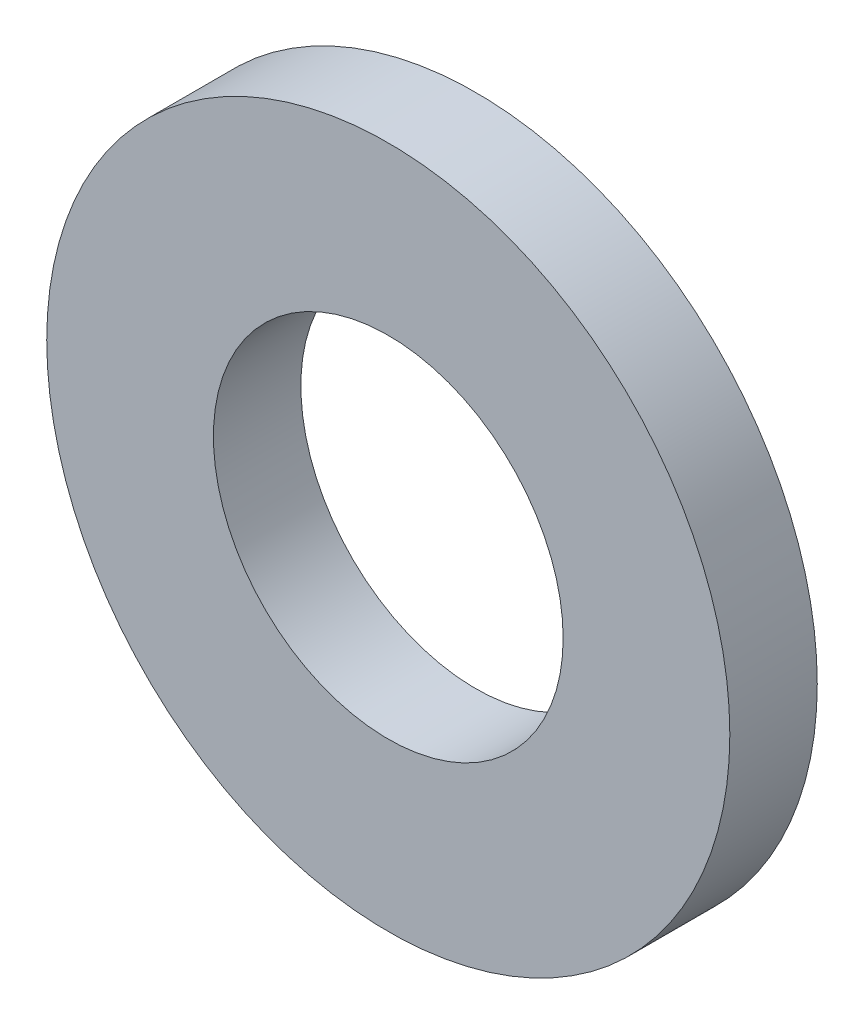
ISO-10303-21;
HEADER;
FILE_DESCRIPTION(('STEP AP214'),'2;1');
FILE_NAME('part.step','',(''),(''),'','','');
FILE_SCHEMA(('AUTOMOTIVE_DESIGN { 1 0 10303 214 1 1 1 1 }'));
ENDSEC;
DATA;
#1=APPLICATION_CONTEXT('core data for automotive mechanical design processes');
#2=APPLICATION_PROTOCOL_DEFINITION('international standard','automotive_design',2000,#1);
#3=PRODUCT_CONTEXT('',#1,'mechanical');
#4=PRODUCT('Part','Part','',(#3));
#5=PRODUCT_RELATED_PRODUCT_CATEGORY('part','',(#4));
#6=PRODUCT_DEFINITION_FORMATION('','',#4);
#7=PRODUCT_DEFINITION_CONTEXT('part definition',#1,'design');
#8=PRODUCT_DEFINITION('design','',#6,#7);
#9=PRODUCT_DEFINITION_SHAPE('','',#8);
#10=(LENGTH_UNIT() NAMED_UNIT(*) SI_UNIT(.MILLI.,.METRE.));
#11=(NAMED_UNIT(*) PLANE_ANGLE_UNIT() SI_UNIT($,.RADIAN.));
#12=(NAMED_UNIT(*) SI_UNIT($,.STERADIAN.) SOLID_ANGLE_UNIT());
#13=UNCERTAINTY_MEASURE_WITH_UNIT(LENGTH_MEASURE(1.E-05),#10,'distance_accuracy_value','');
#14=(GEOMETRIC_REPRESENTATION_CONTEXT(3) GLOBAL_UNCERTAINTY_ASSIGNED_CONTEXT((#13)) GLOBAL_UNIT_ASSIGNED_CONTEXT((#10,
#11,#12)) REPRESENTATION_CONTEXT('',''));
#15=CARTESIAN_POINT('',(0.,0.,0.));
#16=DIRECTION('',(0.,0.,1.));
#17=DIRECTION('',(1.,0.,0.));
#18=AXIS2_PLACEMENT_3D('',#15,#16,#17);
#19=CARTESIAN_POINT('',(0.,0.,0.8));
#20=DIRECTION('',(0.,0.,1.));
#21=DIRECTION('',(1.,0.,0.));
#22=AXIS2_PLACEMENT_3D('',#19,#20,#21);
#23=PLANE('',#22);
#24=CARTESIAN_POINT('',(0.,0.,0.8));
#25=DIRECTION('',(0.,0.,1.));
#26=DIRECTION('',(1.,0.,0.));
#27=AXIS2_PLACEMENT_3D('',#24,#25,#26);
#28=CIRCLE('',#27,6.25);
#29=CARTESIAN_POINT('',(6.25,0.,0.8));
#30=VERTEX_POINT('',#29);
#31=EDGE_CURVE('E10',#30,#30,#28,.T.);
#32=ORIENTED_EDGE('',*,*,#31,.T.);
#33=EDGE_LOOP('',(#32));
#34=FACE_BOUND('',#33,.T.);
#35=CARTESIAN_POINT('',(0.,0.,0.8));
#36=DIRECTION('',(0.,0.,1.));
#37=DIRECTION('',(1.,0.,0.));
#38=AXIS2_PLACEMENT_3D('',#35,#36,#37);
#39=CIRCLE('',#38,3.2);
#40=CARTESIAN_POINT('',(3.2,0.,0.8));
#41=VERTEX_POINT('',#40);
#42=EDGE_CURVE('E39',#41,#41,#39,.T.);
#43=ORIENTED_EDGE('',*,*,#42,.F.);
#44=EDGE_LOOP('',(#43));
#45=FACE_BOUND('',#44,.T.);
#46=ADVANCED_FACE('F28',(#34,#45),#23,.T.);
#47=CARTESIAN_POINT('',(0.,0.,-0.8));
#48=DIRECTION('',(0.,0.,1.));
#49=DIRECTION('',(1.,0.,0.));
#50=AXIS2_PLACEMENT_3D('',#47,#48,#49);
#51=PLANE('',#50);
#52=CARTESIAN_POINT('',(0.,0.,-0.8));
#53=DIRECTION('',(0.,0.,1.));
#54=DIRECTION('',(1.,0.,0.));
#55=AXIS2_PLACEMENT_3D('',#52,#53,#54);
#56=CIRCLE('',#55,6.25);
#57=CARTESIAN_POINT('',(6.25,0.,-0.8));
#58=VERTEX_POINT('',#57);
#59=EDGE_CURVE('E32',#58,#58,#56,.T.);
#60=ORIENTED_EDGE('',*,*,#59,.F.);
#61=EDGE_LOOP('',(#60));
#62=FACE_BOUND('',#61,.T.);
#63=CARTESIAN_POINT('',(0.,0.,-0.8));
#64=DIRECTION('',(0.,0.,1.));
#65=DIRECTION('',(1.,0.,0.));
#66=AXIS2_PLACEMENT_3D('',#63,#64,#65);
#67=CIRCLE('',#66,3.2);
#68=CARTESIAN_POINT('',(3.2,0.,-0.8));
#69=VERTEX_POINT('',#68);
#70=EDGE_CURVE('E41',#69,#69,#67,.T.);
#71=ORIENTED_EDGE('',*,*,#70,.T.);
#72=EDGE_LOOP('',(#71));
#73=FACE_BOUND('',#72,.T.);
#74=ADVANCED_FACE('F51',(#62,#73),#51,.F.);
#75=CARTESIAN_POINT('',(0.,0.,0.8));
#76=DIRECTION('',(0.,0.,-1.));
#77=DIRECTION('',(-1.,0.,0.));
#78=AXIS2_PLACEMENT_3D('',#75,#76,#77);
#79=CYLINDRICAL_SURFACE('',#78,6.25);
#80=ORIENTED_EDGE('',*,*,#31,.F.);
#81=EDGE_LOOP('',(#80));
#82=FACE_BOUND('',#81,.T.);
#83=ORIENTED_EDGE('',*,*,#59,.T.);
#84=EDGE_LOOP('',(#83));
#85=FACE_BOUND('',#84,.T.);
#86=ADVANCED_FACE('F30',(#82,#85),#79,.T.);
#87=CARTESIAN_POINT('',(0.,0.,0.8));
#88=DIRECTION('',(0.,0.,-1.));
#89=DIRECTION('',(-1.,0.,0.));
#90=AXIS2_PLACEMENT_3D('',#87,#88,#89);
#91=CYLINDRICAL_SURFACE('',#90,3.2);
#92=ORIENTED_EDGE('',*,*,#42,.T.);
#93=EDGE_LOOP('',(#92));
#94=FACE_BOUND('',#93,.T.);
#95=ORIENTED_EDGE('',*,*,#70,.F.);
#96=EDGE_LOOP('',(#95));
#97=FACE_BOUND('',#96,.T.);
#98=ADVANCED_FACE('F47',(#94,#97),#91,.F.);
#99=CLOSED_SHELL('',(#46,#74,#86,#98));
#100=MANIFOLD_SOLID_BREP('B2',#99);
#101=ADVANCED_BREP_SHAPE_REPRESENTATION('',(#18,#100),#14);
#102=SHAPE_DEFINITION_REPRESENTATION(#9,#101);
ENDSEC;
END-ISO-10303-21;
